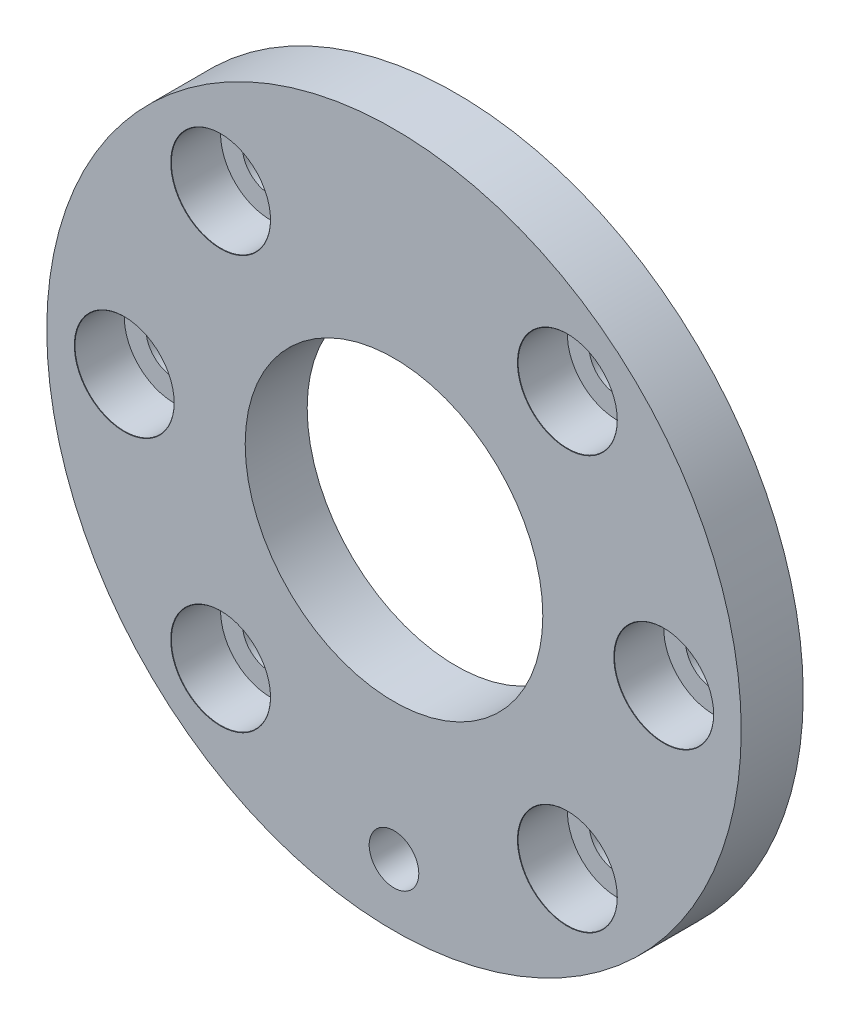
ISO-10303-21;
HEADER;
FILE_DESCRIPTION(('STEP AP214'),'2;1');
FILE_NAME('part.step','',(''),(''),'','','');
FILE_SCHEMA(('AUTOMOTIVE_DESIGN { 1 0 10303 214 1 1 1 1 }'));
ENDSEC;
DATA;
#1=APPLICATION_CONTEXT('core data for automotive mechanical design processes');
#2=APPLICATION_PROTOCOL_DEFINITION('international standard','automotive_design',2000,#1);
#3=PRODUCT_CONTEXT('',#1,'mechanical');
#4=PRODUCT('Part','Part','',(#3));
#5=PRODUCT_RELATED_PRODUCT_CATEGORY('part','',(#4));
#6=PRODUCT_DEFINITION_FORMATION('','',#4);
#7=PRODUCT_DEFINITION_CONTEXT('part definition',#1,'design');
#8=PRODUCT_DEFINITION('design','',#6,#7);
#9=PRODUCT_DEFINITION_SHAPE('','',#8);
#10=(LENGTH_UNIT() NAMED_UNIT(*) SI_UNIT(.MILLI.,.METRE.));
#11=(NAMED_UNIT(*) PLANE_ANGLE_UNIT() SI_UNIT($,.RADIAN.));
#12=(NAMED_UNIT(*) SI_UNIT($,.STERADIAN.) SOLID_ANGLE_UNIT());
#13=UNCERTAINTY_MEASURE_WITH_UNIT(LENGTH_MEASURE(1.E-05),#10,'distance_accuracy_value','');
#14=(GEOMETRIC_REPRESENTATION_CONTEXT(3) GLOBAL_UNCERTAINTY_ASSIGNED_CONTEXT((#13)) GLOBAL_UNIT_ASSIGNED_CONTEXT((#10,
#11,#12)) REPRESENTATION_CONTEXT('',''));
#15=CARTESIAN_POINT('',(0.,0.,0.));
#16=DIRECTION('',(0.,0.,1.));
#17=DIRECTION('',(1.,0.,0.));
#18=AXIS2_PLACEMENT_3D('',#15,#16,#17);
#19=CARTESIAN_POINT('',(0.,0.,5.));
#20=DIRECTION('',(0.,0.,1.));
#21=DIRECTION('',(1.,0.,0.));
#22=AXIS2_PLACEMENT_3D('',#19,#20,#21);
#23=PLANE('',#22);
#24=CARTESIAN_POINT('',(0.,-23.,5.));
#25=DIRECTION('',(0.,0.,1.));
#26=DIRECTION('',(1.,0.,0.));
#27=AXIS2_PLACEMENT_3D('',#24,#25,#26);
#28=CIRCLE('',#27,2.);
#29=CARTESIAN_POINT('',(2.,-23.,5.));
#30=VERTEX_POINT('',#29);
#31=EDGE_CURVE('E179',#30,#30,#28,.F.);
#32=ORIENTED_EDGE('',*,*,#31,.T.);
#33=EDGE_LOOP('',(#32));
#34=FACE_BOUND('',#33,.T.);
#35=CARTESIAN_POINT('',(-13.98063051,16.66146664,5.));
#36=DIRECTION('',(0.,0.,1.));
#37=DIRECTION('',(1.,0.,0.));
#38=AXIS2_PLACEMENT_3D('',#35,#36,#37);
#39=CIRCLE('',#38,4.025);
#40=CARTESIAN_POINT('',(-9.95563051,16.66146664,5.));
#41=VERTEX_POINT('',#40);
#42=EDGE_CURVE('E175',#41,#41,#39,.T.);
#43=ORIENTED_EDGE('',*,*,#42,.F.);
#44=EDGE_LOOP('',(#43));
#45=FACE_BOUND('',#44,.T.);
#46=CARTESIAN_POINT('',(13.98063051,-16.66146664,5.));
#47=DIRECTION('',(0.,0.,1.));
#48=DIRECTION('',(1.,0.,0.));
#49=AXIS2_PLACEMENT_3D('',#46,#47,#48);
#50=CIRCLE('',#49,4.025);
#51=CARTESIAN_POINT('',(18.00563051,-16.66146664,5.));
#52=VERTEX_POINT('',#51);
#53=EDGE_CURVE('E155',#52,#52,#50,.T.);
#54=ORIENTED_EDGE('',*,*,#53,.F.);
#55=EDGE_LOOP('',(#54));
#56=FACE_BOUND('',#55,.T.);
#57=CARTESIAN_POINT('',(-13.98063051,-16.66146664,5.));
#58=DIRECTION('',(0.,0.,1.));
#59=DIRECTION('',(1.,0.,0.));
#60=AXIS2_PLACEMENT_3D('',#57,#58,#59);
#61=CIRCLE('',#60,4.025);
#62=CARTESIAN_POINT('',(-9.95563051,-16.66146664,5.));
#63=VERTEX_POINT('',#62);
#64=EDGE_CURVE('E135',#63,#63,#61,.T.);
#65=ORIENTED_EDGE('',*,*,#64,.F.);
#66=EDGE_LOOP('',(#65));
#67=FACE_BOUND('',#66,.T.);
#68=CARTESIAN_POINT('',(13.98063051,16.66146664,5.));
#69=DIRECTION('',(0.,0.,1.));
#70=DIRECTION('',(1.,0.,0.));
#71=AXIS2_PLACEMENT_3D('',#68,#69,#70);
#72=CIRCLE('',#71,4.025);
#73=CARTESIAN_POINT('',(18.00563051,16.66146664,5.));
#74=VERTEX_POINT('',#73);
#75=EDGE_CURVE('E115',#74,#74,#72,.T.);
#76=ORIENTED_EDGE('',*,*,#75,.F.);
#77=EDGE_LOOP('',(#76));
#78=FACE_BOUND('',#77,.T.);
#79=CARTESIAN_POINT('',(-21.75,0.,5.));
#80=DIRECTION('',(0.,0.,1.));
#81=DIRECTION('',(1.,0.,0.));
#82=AXIS2_PLACEMENT_3D('',#79,#80,#81);
#83=CIRCLE('',#82,4.025);
#84=CARTESIAN_POINT('',(-17.725,0.,5.));
#85=VERTEX_POINT('',#84);
#86=EDGE_CURVE('E95',#85,#85,#83,.T.);
#87=ORIENTED_EDGE('',*,*,#86,.F.);
#88=EDGE_LOOP('',(#87));
#89=FACE_BOUND('',#88,.T.);
#90=CARTESIAN_POINT('',(21.75,0.,5.));
#91=DIRECTION('',(0.,0.,1.));
#92=DIRECTION('',(1.,0.,0.));
#93=AXIS2_PLACEMENT_3D('',#90,#91,#92);
#94=CIRCLE('',#93,4.025);
#95=CARTESIAN_POINT('',(25.775,0.,5.));
#96=VERTEX_POINT('',#95);
#97=EDGE_CURVE('E75',#96,#96,#94,.T.);
#98=ORIENTED_EDGE('',*,*,#97,.F.);
#99=EDGE_LOOP('',(#98));
#100=FACE_BOUND('',#99,.T.);
#101=CARTESIAN_POINT('',(0.,0.,5.));
#102=DIRECTION('',(0.,0.,1.));
#103=DIRECTION('',(1.,0.,0.));
#104=AXIS2_PLACEMENT_3D('',#101,#102,#103);
#105=CIRCLE('',#104,28.);
#106=CARTESIAN_POINT('',(28.,0.,5.));
#107=VERTEX_POINT('',#106);
#108=EDGE_CURVE('E10',#107,#107,#105,.T.);
#109=ORIENTED_EDGE('',*,*,#108,.T.);
#110=EDGE_LOOP('',(#109));
#111=FACE_BOUND('',#110,.T.);
#112=CARTESIAN_POINT('',(0.,0.,5.));
#113=DIRECTION('',(0.,0.,1.));
#114=DIRECTION('',(1.,0.,0.));
#115=AXIS2_PLACEMENT_3D('',#112,#113,#114);
#116=CIRCLE('',#115,12.);
#117=CARTESIAN_POINT('',(12.,0.,5.));
#118=VERTEX_POINT('',#117);
#119=EDGE_CURVE('E50',#118,#118,#116,.T.);
#120=ORIENTED_EDGE('',*,*,#119,.F.);
#121=EDGE_LOOP('',(#120));
#122=FACE_BOUND('',#121,.T.);
#123=ADVANCED_FACE('F37',(#34,#45,#56,#67,#78,#89,#100,#111,#122),#23,.T.);
#124=CARTESIAN_POINT('',(0.,0.,0.));
#125=DIRECTION('',(0.,0.,1.));
#126=DIRECTION('',(1.,0.,0.));
#127=AXIS2_PLACEMENT_3D('',#124,#125,#126);
#128=PLANE('',#127);
#129=CARTESIAN_POINT('',(0.,-23.,0.));
#130=DIRECTION('',(0.,0.,1.));
#131=DIRECTION('',(1.,0.,0.));
#132=AXIS2_PLACEMENT_3D('',#129,#130,#131);
#133=CIRCLE('',#132,2.);
#134=CARTESIAN_POINT('',(2.,-23.,0.));
#135=VERTEX_POINT('',#134);
#136=EDGE_CURVE('E183',#135,#135,#133,.T.);
#137=ORIENTED_EDGE('',*,*,#136,.T.);
#138=EDGE_LOOP('',(#137));
#139=FACE_BOUND('',#138,.T.);
#140=CARTESIAN_POINT('',(-13.98063051,16.66146664,0.));
#141=DIRECTION('',(0.,0.,1.));
#142=DIRECTION('',(1.,0.,0.));
#143=AXIS2_PLACEMENT_3D('',#140,#141,#142);
#144=CIRCLE('',#143,2.25);
#145=CARTESIAN_POINT('',(-11.73063051,16.66146664,0.));
#146=VERTEX_POINT('',#145);
#147=EDGE_CURVE('E159',#146,#146,#144,.T.);
#148=ORIENTED_EDGE('',*,*,#147,.T.);
#149=EDGE_LOOP('',(#148));
#150=FACE_BOUND('',#149,.T.);
#151=CARTESIAN_POINT('',(13.98063051,-16.66146664,0.));
#152=DIRECTION('',(0.,0.,1.));
#153=DIRECTION('',(1.,0.,0.));
#154=AXIS2_PLACEMENT_3D('',#151,#152,#153);
#155=CIRCLE('',#154,2.25);
#156=CARTESIAN_POINT('',(16.23063051,-16.66146664,0.));
#157=VERTEX_POINT('',#156);
#158=EDGE_CURVE('E139',#157,#157,#155,.T.);
#159=ORIENTED_EDGE('',*,*,#158,.T.);
#160=EDGE_LOOP('',(#159));
#161=FACE_BOUND('',#160,.T.);
#162=CARTESIAN_POINT('',(-13.98063051,-16.66146664,0.));
#163=DIRECTION('',(0.,0.,1.));
#164=DIRECTION('',(1.,0.,0.));
#165=AXIS2_PLACEMENT_3D('',#162,#163,#164);
#166=CIRCLE('',#165,2.25);
#167=CARTESIAN_POINT('',(-11.73063051,-16.66146664,0.));
#168=VERTEX_POINT('',#167);
#169=EDGE_CURVE('E119',#168,#168,#166,.T.);
#170=ORIENTED_EDGE('',*,*,#169,.T.);
#171=EDGE_LOOP('',(#170));
#172=FACE_BOUND('',#171,.T.);
#173=CARTESIAN_POINT('',(13.98063051,16.66146664,0.));
#174=DIRECTION('',(0.,0.,1.));
#175=DIRECTION('',(1.,0.,0.));
#176=AXIS2_PLACEMENT_3D('',#173,#174,#175);
#177=CIRCLE('',#176,2.25);
#178=CARTESIAN_POINT('',(16.23063051,16.66146664,0.));
#179=VERTEX_POINT('',#178);
#180=EDGE_CURVE('E99',#179,#179,#177,.T.);
#181=ORIENTED_EDGE('',*,*,#180,.T.);
#182=EDGE_LOOP('',(#181));
#183=FACE_BOUND('',#182,.T.);
#184=CARTESIAN_POINT('',(-21.75,0.,0.));
#185=DIRECTION('',(0.,0.,1.));
#186=DIRECTION('',(1.,0.,0.));
#187=AXIS2_PLACEMENT_3D('',#184,#185,#186);
#188=CIRCLE('',#187,2.25);
#189=CARTESIAN_POINT('',(-19.5,0.,0.));
#190=VERTEX_POINT('',#189);
#191=EDGE_CURVE('E79',#190,#190,#188,.T.);
#192=ORIENTED_EDGE('',*,*,#191,.T.);
#193=EDGE_LOOP('',(#192));
#194=FACE_BOUND('',#193,.T.);
#195=CARTESIAN_POINT('',(21.75,0.,0.));
#196=DIRECTION('',(0.,0.,1.));
#197=DIRECTION('',(1.,0.,0.));
#198=AXIS2_PLACEMENT_3D('',#195,#196,#197);
#199=CIRCLE('',#198,2.25);
#200=CARTESIAN_POINT('',(24.,0.,0.));
#201=VERTEX_POINT('',#200);
#202=EDGE_CURVE('E56',#201,#201,#199,.T.);
#203=ORIENTED_EDGE('',*,*,#202,.T.);
#204=EDGE_LOOP('',(#203));
#205=FACE_BOUND('',#204,.T.);
#206=CARTESIAN_POINT('',(0.,0.,0.));
#207=DIRECTION('',(0.,0.,1.));
#208=DIRECTION('',(1.,0.,0.));
#209=AXIS2_PLACEMENT_3D('',#206,#207,#208);
#210=CIRCLE('',#209,28.);
#211=CARTESIAN_POINT('',(28.,0.,0.));
#212=VERTEX_POINT('',#211);
#213=EDGE_CURVE('E41',#212,#212,#210,.T.);
#214=ORIENTED_EDGE('',*,*,#213,.F.);
#215=EDGE_LOOP('',(#214));
#216=FACE_BOUND('',#215,.T.);
#217=CARTESIAN_POINT('',(0.,0.,0.));
#218=DIRECTION('',(0.,0.,1.));
#219=DIRECTION('',(1.,0.,0.));
#220=AXIS2_PLACEMENT_3D('',#217,#218,#219);
#221=CIRCLE('',#220,12.);
#222=CARTESIAN_POINT('',(12.,0.,0.));
#223=VERTEX_POINT('',#222);
#224=EDGE_CURVE('E52',#223,#223,#221,.T.);
#225=ORIENTED_EDGE('',*,*,#224,.T.);
#226=EDGE_LOOP('',(#225));
#227=FACE_BOUND('',#226,.T.);
#228=ADVANCED_FACE('F188',(#139,#150,#161,#172,#183,#194,#205,#216,#227),#128,.F.);
#229=CARTESIAN_POINT('',(0.,0.,5.));
#230=DIRECTION('',(0.,0.,-1.));
#231=DIRECTION('',(-1.,0.,0.));
#232=AXIS2_PLACEMENT_3D('',#229,#230,#231);
#233=CYLINDRICAL_SURFACE('',#232,28.);
#234=ORIENTED_EDGE('',*,*,#108,.F.);
#235=EDGE_LOOP('',(#234));
#236=FACE_BOUND('',#235,.T.);
#237=ORIENTED_EDGE('',*,*,#213,.T.);
#238=EDGE_LOOP('',(#237));
#239=FACE_BOUND('',#238,.T.);
#240=ADVANCED_FACE('F39',(#236,#239),#233,.T.);
#241=CARTESIAN_POINT('',(0.,0.,5.));
#242=DIRECTION('',(0.,0.,-1.));
#243=DIRECTION('',(-1.,0.,0.));
#244=AXIS2_PLACEMENT_3D('',#241,#242,#243);
#245=CYLINDRICAL_SURFACE('',#244,12.);
#246=ORIENTED_EDGE('',*,*,#119,.T.);
#247=EDGE_LOOP('',(#246));
#248=FACE_BOUND('',#247,.T.);
#249=ORIENTED_EDGE('',*,*,#224,.F.);
#250=EDGE_LOOP('',(#249));
#251=FACE_BOUND('',#250,.T.);
#252=ADVANCED_FACE('F211',(#248,#251),#245,.F.);
#253=CARTESIAN_POINT('',(21.75,0.,5.));
#254=DIRECTION('',(0.,0.,1.));
#255=DIRECTION('',(1.,0.,0.));
#256=AXIS2_PLACEMENT_3D('',#253,#254,#255);
#257=CYLINDRICAL_SURFACE('',#256,2.25);
#258=ORIENTED_EDGE('',*,*,#202,.F.);
#259=EDGE_LOOP('',(#258));
#260=FACE_BOUND('',#259,.T.);
#261=CARTESIAN_POINT('',(21.75,0.,0.999999999999999));
#262=DIRECTION('',(0.,0.,1.));
#263=DIRECTION('',(1.,0.,0.));
#264=AXIS2_PLACEMENT_3D('',#261,#262,#263);
#265=CIRCLE('',#264,2.25);
#266=CARTESIAN_POINT('',(24.,0.,0.999999999999999));
#267=VERTEX_POINT('',#266);
#268=EDGE_CURVE('E63',#267,#267,#265,.T.);
#269=ORIENTED_EDGE('',*,*,#268,.T.);
#270=EDGE_LOOP('',(#269));
#271=FACE_BOUND('',#270,.T.);
#272=ADVANCED_FACE('F214',(#260,#271),#257,.F.);
#273=CARTESIAN_POINT('',(25.75,0.,0.999999999999999));
#274=DIRECTION('',(0.,0.,-1.));
#275=DIRECTION('',(-1.,0.,0.));
#276=AXIS2_PLACEMENT_3D('',#273,#274,#275);
#277=PLANE('',#276);
#278=ORIENTED_EDGE('',*,*,#268,.F.);
#279=EDGE_LOOP('',(#278));
#280=FACE_BOUND('',#279,.T.);
#281=CARTESIAN_POINT('',(21.75,0.,0.999999999999999));
#282=DIRECTION('',(0.,0.,1.));
#283=DIRECTION('',(1.,0.,0.));
#284=AXIS2_PLACEMENT_3D('',#281,#282,#283);
#285=CIRCLE('',#284,4.);
#286=CARTESIAN_POINT('',(25.75,0.,0.999999999999999));
#287=VERTEX_POINT('',#286);
#288=EDGE_CURVE('E67',#287,#287,#285,.T.);
#289=ORIENTED_EDGE('',*,*,#288,.T.);
#290=EDGE_LOOP('',(#289));
#291=FACE_BOUND('',#290,.T.);
#292=ADVANCED_FACE('F218',(#280,#291),#277,.F.);
#293=CARTESIAN_POINT('',(21.75,0.,5.));
#294=DIRECTION('',(0.,0.,1.));
#295=DIRECTION('',(1.,0.,0.));
#296=AXIS2_PLACEMENT_3D('',#293,#294,#295);
#297=CYLINDRICAL_SURFACE('',#296,4.);
#298=ORIENTED_EDGE('',*,*,#288,.F.);
#299=EDGE_LOOP('',(#298));
#300=FACE_BOUND('',#299,.T.);
#301=CARTESIAN_POINT('',(21.75,0.,4.97585778062982));
#302=DIRECTION('',(0.,0.,1.));
#303=DIRECTION('',(1.,0.,0.));
#304=AXIS2_PLACEMENT_3D('',#301,#302,#303);
#305=CIRCLE('',#304,4.);
#306=CARTESIAN_POINT('',(25.75,0.,4.97585778062982));
#307=VERTEX_POINT('',#306);
#308=EDGE_CURVE('E71',#307,#307,#305,.T.);
#309=ORIENTED_EDGE('',*,*,#308,.T.);
#310=EDGE_LOOP('',(#309));
#311=FACE_BOUND('',#310,.T.);
#312=ADVANCED_FACE('F222',(#300,#311),#297,.F.);
#313=CARTESIAN_POINT('',(21.75,0.,5.));
#314=DIRECTION('',(0.,0.,1.));
#315=DIRECTION('',(1.,0.,0.));
#316=AXIS2_PLACEMENT_3D('',#313,#314,#315);
#317=CONICAL_SURFACE('',#316,4.025,0.802851455917437);
#318=ORIENTED_EDGE('',*,*,#308,.F.);
#319=EDGE_LOOP('',(#318));
#320=FACE_BOUND('',#319,.T.);
#321=ORIENTED_EDGE('',*,*,#97,.T.);
#322=EDGE_LOOP('',(#321));
#323=FACE_BOUND('',#322,.T.);
#324=ADVANCED_FACE('F226',(#320,#323),#317,.F.);
#325=CARTESIAN_POINT('',(-21.75,0.,5.));
#326=DIRECTION('',(0.,0.,1.));
#327=DIRECTION('',(1.,0.,0.));
#328=AXIS2_PLACEMENT_3D('',#325,#326,#327);
#329=CYLINDRICAL_SURFACE('',#328,2.25);
#330=ORIENTED_EDGE('',*,*,#191,.F.);
#331=EDGE_LOOP('',(#330));
#332=FACE_BOUND('',#331,.T.);
#333=CARTESIAN_POINT('',(-21.75,0.,1.));
#334=DIRECTION('',(0.,0.,1.));
#335=DIRECTION('',(1.,0.,0.));
#336=AXIS2_PLACEMENT_3D('',#333,#334,#335);
#337=CIRCLE('',#336,2.25);
#338=CARTESIAN_POINT('',(-19.5,0.,1.));
#339=VERTEX_POINT('',#338);
#340=EDGE_CURVE('E83',#339,#339,#337,.T.);
#341=ORIENTED_EDGE('',*,*,#340,.T.);
#342=EDGE_LOOP('',(#341));
#343=FACE_BOUND('',#342,.T.);
#344=ADVANCED_FACE('F230',(#332,#343),#329,.F.);
#345=CARTESIAN_POINT('',(-17.75,0.,1.));
#346=DIRECTION('',(0.,0.,-1.));
#347=DIRECTION('',(-1.,0.,0.));
#348=AXIS2_PLACEMENT_3D('',#345,#346,#347);
#349=PLANE('',#348);
#350=ORIENTED_EDGE('',*,*,#340,.F.);
#351=EDGE_LOOP('',(#350));
#352=FACE_BOUND('',#351,.T.);
#353=CARTESIAN_POINT('',(-21.75,0.,1.));
#354=DIRECTION('',(0.,0.,1.));
#355=DIRECTION('',(1.,0.,0.));
#356=AXIS2_PLACEMENT_3D('',#353,#354,#355);
#357=CIRCLE('',#356,4.);
#358=CARTESIAN_POINT('',(-17.75,0.,1.));
#359=VERTEX_POINT('',#358);
#360=EDGE_CURVE('E87',#359,#359,#357,.T.);
#361=ORIENTED_EDGE('',*,*,#360,.T.);
#362=EDGE_LOOP('',(#361));
#363=FACE_BOUND('',#362,.T.);
#364=ADVANCED_FACE('F234',(#352,#363),#349,.F.);
#365=CARTESIAN_POINT('',(-21.75,0.,5.));
#366=DIRECTION('',(0.,0.,1.));
#367=DIRECTION('',(1.,0.,0.));
#368=AXIS2_PLACEMENT_3D('',#365,#366,#367);
#369=CYLINDRICAL_SURFACE('',#368,4.);
#370=ORIENTED_EDGE('',*,*,#360,.F.);
#371=EDGE_LOOP('',(#370));
#372=FACE_BOUND('',#371,.T.);
#373=CARTESIAN_POINT('',(-21.75,0.,4.97585778062982));
#374=DIRECTION('',(0.,0.,1.));
#375=DIRECTION('',(1.,0.,0.));
#376=AXIS2_PLACEMENT_3D('',#373,#374,#375);
#377=CIRCLE('',#376,4.);
#378=CARTESIAN_POINT('',(-17.75,0.,4.97585778062982));
#379=VERTEX_POINT('',#378);
#380=EDGE_CURVE('E91',#379,#379,#377,.T.);
#381=ORIENTED_EDGE('',*,*,#380,.T.);
#382=EDGE_LOOP('',(#381));
#383=FACE_BOUND('',#382,.T.);
#384=ADVANCED_FACE('F238',(#372,#383),#369,.F.);
#385=CARTESIAN_POINT('',(-21.75,0.,5.));
#386=DIRECTION('',(0.,0.,1.));
#387=DIRECTION('',(1.,0.,0.));
#388=AXIS2_PLACEMENT_3D('',#385,#386,#387);
#389=CONICAL_SURFACE('',#388,4.025,0.802851455917437);
#390=ORIENTED_EDGE('',*,*,#380,.F.);
#391=EDGE_LOOP('',(#390));
#392=FACE_BOUND('',#391,.T.);
#393=ORIENTED_EDGE('',*,*,#86,.T.);
#394=EDGE_LOOP('',(#393));
#395=FACE_BOUND('',#394,.T.);
#396=ADVANCED_FACE('F242',(#392,#395),#389,.F.);
#397=CARTESIAN_POINT('',(13.98063051,16.66146664,5.));
#398=DIRECTION('',(0.,0.,1.));
#399=DIRECTION('',(1.,0.,0.));
#400=AXIS2_PLACEMENT_3D('',#397,#398,#399);
#401=CYLINDRICAL_SURFACE('',#400,2.25);
#402=ORIENTED_EDGE('',*,*,#180,.F.);
#403=EDGE_LOOP('',(#402));
#404=FACE_BOUND('',#403,.T.);
#405=CARTESIAN_POINT('',(13.98063051,16.66146664,1.));
#406=DIRECTION('',(0.,0.,1.));
#407=DIRECTION('',(1.,0.,0.));
#408=AXIS2_PLACEMENT_3D('',#405,#406,#407);
#409=CIRCLE('',#408,2.25);
#410=CARTESIAN_POINT('',(16.23063051,16.66146664,1.));
#411=VERTEX_POINT('',#410);
#412=EDGE_CURVE('E103',#411,#411,#409,.T.);
#413=ORIENTED_EDGE('',*,*,#412,.T.);
#414=EDGE_LOOP('',(#413));
#415=FACE_BOUND('',#414,.T.);
#416=ADVANCED_FACE('F246',(#404,#415),#401,.F.);
#417=CARTESIAN_POINT('',(17.98063051,16.66146664,1.));
#418=DIRECTION('',(0.,0.,-1.));
#419=DIRECTION('',(-1.,0.,0.));
#420=AXIS2_PLACEMENT_3D('',#417,#418,#419);
#421=PLANE('',#420);
#422=ORIENTED_EDGE('',*,*,#412,.F.);
#423=EDGE_LOOP('',(#422));
#424=FACE_BOUND('',#423,.T.);
#425=CARTESIAN_POINT('',(13.98063051,16.66146664,1.));
#426=DIRECTION('',(0.,0.,1.));
#427=DIRECTION('',(1.,0.,0.));
#428=AXIS2_PLACEMENT_3D('',#425,#426,#427);
#429=CIRCLE('',#428,4.);
#430=CARTESIAN_POINT('',(17.98063051,16.66146664,1.));
#431=VERTEX_POINT('',#430);
#432=EDGE_CURVE('E107',#431,#431,#429,.T.);
#433=ORIENTED_EDGE('',*,*,#432,.T.);
#434=EDGE_LOOP('',(#433));
#435=FACE_BOUND('',#434,.T.);
#436=ADVANCED_FACE('F250',(#424,#435),#421,.F.);
#437=CARTESIAN_POINT('',(13.98063051,16.66146664,5.));
#438=DIRECTION('',(0.,0.,1.));
#439=DIRECTION('',(1.,0.,0.));
#440=AXIS2_PLACEMENT_3D('',#437,#438,#439);
#441=CYLINDRICAL_SURFACE('',#440,4.);
#442=ORIENTED_EDGE('',*,*,#432,.F.);
#443=EDGE_LOOP('',(#442));
#444=FACE_BOUND('',#443,.T.);
#445=CARTESIAN_POINT('',(13.98063051,16.66146664,4.97585778062982));
#446=DIRECTION('',(0.,0.,1.));
#447=DIRECTION('',(1.,0.,0.));
#448=AXIS2_PLACEMENT_3D('',#445,#446,#447);
#449=CIRCLE('',#448,4.);
#450=CARTESIAN_POINT('',(17.98063051,16.66146664,4.97585778062982));
#451=VERTEX_POINT('',#450);
#452=EDGE_CURVE('E111',#451,#451,#449,.T.);
#453=ORIENTED_EDGE('',*,*,#452,.T.);
#454=EDGE_LOOP('',(#453));
#455=FACE_BOUND('',#454,.T.);
#456=ADVANCED_FACE('F254',(#444,#455),#441,.F.);
#457=CARTESIAN_POINT('',(13.98063051,16.66146664,5.));
#458=DIRECTION('',(0.,0.,1.));
#459=DIRECTION('',(1.,0.,0.));
#460=AXIS2_PLACEMENT_3D('',#457,#458,#459);
#461=CONICAL_SURFACE('',#460,4.025,0.802851455917437);
#462=ORIENTED_EDGE('',*,*,#452,.F.);
#463=EDGE_LOOP('',(#462));
#464=FACE_BOUND('',#463,.T.);
#465=ORIENTED_EDGE('',*,*,#75,.T.);
#466=EDGE_LOOP('',(#465));
#467=FACE_BOUND('',#466,.T.);
#468=ADVANCED_FACE('F258',(#464,#467),#461,.F.);
#469=CARTESIAN_POINT('',(-13.98063051,-16.66146664,5.));
#470=DIRECTION('',(0.,0.,1.));
#471=DIRECTION('',(1.,0.,0.));
#472=AXIS2_PLACEMENT_3D('',#469,#470,#471);
#473=CYLINDRICAL_SURFACE('',#472,2.25);
#474=ORIENTED_EDGE('',*,*,#169,.F.);
#475=EDGE_LOOP('',(#474));
#476=FACE_BOUND('',#475,.T.);
#477=CARTESIAN_POINT('',(-13.98063051,-16.66146664,1.));
#478=DIRECTION('',(0.,0.,1.));
#479=DIRECTION('',(1.,0.,0.));
#480=AXIS2_PLACEMENT_3D('',#477,#478,#479);
#481=CIRCLE('',#480,2.25);
#482=CARTESIAN_POINT('',(-11.73063051,-16.66146664,1.));
#483=VERTEX_POINT('',#482);
#484=EDGE_CURVE('E123',#483,#483,#481,.T.);
#485=ORIENTED_EDGE('',*,*,#484,.T.);
#486=EDGE_LOOP('',(#485));
#487=FACE_BOUND('',#486,.T.);
#488=ADVANCED_FACE('F262',(#476,#487),#473,.F.);
#489=CARTESIAN_POINT('',(-9.98063051,-16.66146664,1.));
#490=DIRECTION('',(0.,0.,-1.));
#491=DIRECTION('',(-1.,0.,0.));
#492=AXIS2_PLACEMENT_3D('',#489,#490,#491);
#493=PLANE('',#492);
#494=ORIENTED_EDGE('',*,*,#484,.F.);
#495=EDGE_LOOP('',(#494));
#496=FACE_BOUND('',#495,.T.);
#497=CARTESIAN_POINT('',(-13.98063051,-16.66146664,1.));
#498=DIRECTION('',(0.,0.,1.));
#499=DIRECTION('',(1.,0.,0.));
#500=AXIS2_PLACEMENT_3D('',#497,#498,#499);
#501=CIRCLE('',#500,4.);
#502=CARTESIAN_POINT('',(-9.98063051,-16.66146664,1.));
#503=VERTEX_POINT('',#502);
#504=EDGE_CURVE('E127',#503,#503,#501,.T.);
#505=ORIENTED_EDGE('',*,*,#504,.T.);
#506=EDGE_LOOP('',(#505));
#507=FACE_BOUND('',#506,.T.);
#508=ADVANCED_FACE('F266',(#496,#507),#493,.F.);
#509=CARTESIAN_POINT('',(-13.98063051,-16.66146664,5.));
#510=DIRECTION('',(0.,0.,1.));
#511=DIRECTION('',(1.,0.,0.));
#512=AXIS2_PLACEMENT_3D('',#509,#510,#511);
#513=CYLINDRICAL_SURFACE('',#512,4.);
#514=ORIENTED_EDGE('',*,*,#504,.F.);
#515=EDGE_LOOP('',(#514));
#516=FACE_BOUND('',#515,.T.);
#517=CARTESIAN_POINT('',(-13.98063051,-16.66146664,4.97585778062982));
#518=DIRECTION('',(0.,0.,1.));
#519=DIRECTION('',(1.,0.,0.));
#520=AXIS2_PLACEMENT_3D('',#517,#518,#519);
#521=CIRCLE('',#520,4.);
#522=CARTESIAN_POINT('',(-9.98063051,-16.66146664,4.97585778062982));
#523=VERTEX_POINT('',#522);
#524=EDGE_CURVE('E131',#523,#523,#521,.T.);
#525=ORIENTED_EDGE('',*,*,#524,.T.);
#526=EDGE_LOOP('',(#525));
#527=FACE_BOUND('',#526,.T.);
#528=ADVANCED_FACE('F270',(#516,#527),#513,.F.);
#529=CARTESIAN_POINT('',(-13.98063051,-16.66146664,5.));
#530=DIRECTION('',(0.,0.,1.));
#531=DIRECTION('',(1.,0.,0.));
#532=AXIS2_PLACEMENT_3D('',#529,#530,#531);
#533=CONICAL_SURFACE('',#532,4.025,0.802851455917402);
#534=ORIENTED_EDGE('',*,*,#524,.F.);
#535=EDGE_LOOP('',(#534));
#536=FACE_BOUND('',#535,.T.);
#537=ORIENTED_EDGE('',*,*,#64,.T.);
#538=EDGE_LOOP('',(#537));
#539=FACE_BOUND('',#538,.T.);
#540=ADVANCED_FACE('F274',(#536,#539),#533,.F.);
#541=CARTESIAN_POINT('',(13.98063051,-16.66146664,5.));
#542=DIRECTION('',(0.,0.,1.));
#543=DIRECTION('',(1.,0.,0.));
#544=AXIS2_PLACEMENT_3D('',#541,#542,#543);
#545=CYLINDRICAL_SURFACE('',#544,2.25);
#546=ORIENTED_EDGE('',*,*,#158,.F.);
#547=EDGE_LOOP('',(#546));
#548=FACE_BOUND('',#547,.T.);
#549=CARTESIAN_POINT('',(13.98063051,-16.66146664,1.));
#550=DIRECTION('',(0.,0.,1.));
#551=DIRECTION('',(1.,0.,0.));
#552=AXIS2_PLACEMENT_3D('',#549,#550,#551);
#553=CIRCLE('',#552,2.25);
#554=CARTESIAN_POINT('',(16.23063051,-16.66146664,1.));
#555=VERTEX_POINT('',#554);
#556=EDGE_CURVE('E143',#555,#555,#553,.T.);
#557=ORIENTED_EDGE('',*,*,#556,.T.);
#558=EDGE_LOOP('',(#557));
#559=FACE_BOUND('',#558,.T.);
#560=ADVANCED_FACE('F278',(#548,#559),#545,.F.);
#561=CARTESIAN_POINT('',(17.98063051,-16.66146664,1.));
#562=DIRECTION('',(0.,0.,-1.));
#563=DIRECTION('',(-1.,0.,0.));
#564=AXIS2_PLACEMENT_3D('',#561,#562,#563);
#565=PLANE('',#564);
#566=ORIENTED_EDGE('',*,*,#556,.F.);
#567=EDGE_LOOP('',(#566));
#568=FACE_BOUND('',#567,.T.);
#569=CARTESIAN_POINT('',(13.98063051,-16.66146664,1.));
#570=DIRECTION('',(0.,0.,1.));
#571=DIRECTION('',(1.,0.,0.));
#572=AXIS2_PLACEMENT_3D('',#569,#570,#571);
#573=CIRCLE('',#572,4.);
#574=CARTESIAN_POINT('',(17.98063051,-16.66146664,1.));
#575=VERTEX_POINT('',#574);
#576=EDGE_CURVE('E147',#575,#575,#573,.T.);
#577=ORIENTED_EDGE('',*,*,#576,.T.);
#578=EDGE_LOOP('',(#577));
#579=FACE_BOUND('',#578,.T.);
#580=ADVANCED_FACE('F282',(#568,#579),#565,.F.);
#581=CARTESIAN_POINT('',(13.98063051,-16.66146664,5.));
#582=DIRECTION('',(0.,0.,1.));
#583=DIRECTION('',(1.,0.,0.));
#584=AXIS2_PLACEMENT_3D('',#581,#582,#583);
#585=CYLINDRICAL_SURFACE('',#584,4.);
#586=ORIENTED_EDGE('',*,*,#576,.F.);
#587=EDGE_LOOP('',(#586));
#588=FACE_BOUND('',#587,.T.);
#589=CARTESIAN_POINT('',(13.98063051,-16.66146664,4.97585778062982));
#590=DIRECTION('',(0.,0.,1.));
#591=DIRECTION('',(1.,0.,0.));
#592=AXIS2_PLACEMENT_3D('',#589,#590,#591);
#593=CIRCLE('',#592,4.);
#594=CARTESIAN_POINT('',(17.98063051,-16.66146664,4.97585778062982));
#595=VERTEX_POINT('',#594);
#596=EDGE_CURVE('E151',#595,#595,#593,.T.);
#597=ORIENTED_EDGE('',*,*,#596,.T.);
#598=EDGE_LOOP('',(#597));
#599=FACE_BOUND('',#598,.T.);
#600=ADVANCED_FACE('F286',(#588,#599),#585,.F.);
#601=CARTESIAN_POINT('',(13.98063051,-16.66146664,5.));
#602=DIRECTION('',(0.,0.,1.));
#603=DIRECTION('',(1.,0.,0.));
#604=AXIS2_PLACEMENT_3D('',#601,#602,#603);
#605=CONICAL_SURFACE('',#604,4.025,0.802851455917437);
#606=ORIENTED_EDGE('',*,*,#596,.F.);
#607=EDGE_LOOP('',(#606));
#608=FACE_BOUND('',#607,.T.);
#609=ORIENTED_EDGE('',*,*,#53,.T.);
#610=EDGE_LOOP('',(#609));
#611=FACE_BOUND('',#610,.T.);
#612=ADVANCED_FACE('F290',(#608,#611),#605,.F.);
#613=CARTESIAN_POINT('',(-13.98063051,16.66146664,5.));
#614=DIRECTION('',(0.,0.,1.));
#615=DIRECTION('',(1.,0.,0.));
#616=AXIS2_PLACEMENT_3D('',#613,#614,#615);
#617=CYLINDRICAL_SURFACE('',#616,2.25);
#618=ORIENTED_EDGE('',*,*,#147,.F.);
#619=EDGE_LOOP('',(#618));
#620=FACE_BOUND('',#619,.T.);
#621=CARTESIAN_POINT('',(-13.98063051,16.66146664,1.));
#622=DIRECTION('',(0.,0.,1.));
#623=DIRECTION('',(1.,0.,0.));
#624=AXIS2_PLACEMENT_3D('',#621,#622,#623);
#625=CIRCLE('',#624,2.25);
#626=CARTESIAN_POINT('',(-11.73063051,16.66146664,1.));
#627=VERTEX_POINT('',#626);
#628=EDGE_CURVE('E163',#627,#627,#625,.T.);
#629=ORIENTED_EDGE('',*,*,#628,.T.);
#630=EDGE_LOOP('',(#629));
#631=FACE_BOUND('',#630,.T.);
#632=ADVANCED_FACE('F294',(#620,#631),#617,.F.);
#633=CARTESIAN_POINT('',(-9.98063051,16.66146664,1.));
#634=DIRECTION('',(0.,0.,-1.));
#635=DIRECTION('',(-1.,0.,0.));
#636=AXIS2_PLACEMENT_3D('',#633,#634,#635);
#637=PLANE('',#636);
#638=ORIENTED_EDGE('',*,*,#628,.F.);
#639=EDGE_LOOP('',(#638));
#640=FACE_BOUND('',#639,.T.);
#641=CARTESIAN_POINT('',(-13.98063051,16.66146664,1.));
#642=DIRECTION('',(0.,0.,1.));
#643=DIRECTION('',(1.,0.,0.));
#644=AXIS2_PLACEMENT_3D('',#641,#642,#643);
#645=CIRCLE('',#644,4.);
#646=CARTESIAN_POINT('',(-9.98063051,16.66146664,1.));
#647=VERTEX_POINT('',#646);
#648=EDGE_CURVE('E167',#647,#647,#645,.T.);
#649=ORIENTED_EDGE('',*,*,#648,.T.);
#650=EDGE_LOOP('',(#649));
#651=FACE_BOUND('',#650,.T.);
#652=ADVANCED_FACE('F298',(#640,#651),#637,.F.);
#653=CARTESIAN_POINT('',(-13.98063051,16.66146664,5.));
#654=DIRECTION('',(0.,0.,1.));
#655=DIRECTION('',(1.,0.,0.));
#656=AXIS2_PLACEMENT_3D('',#653,#654,#655);
#657=CYLINDRICAL_SURFACE('',#656,4.);
#658=ORIENTED_EDGE('',*,*,#648,.F.);
#659=EDGE_LOOP('',(#658));
#660=FACE_BOUND('',#659,.T.);
#661=CARTESIAN_POINT('',(-13.98063051,16.66146664,4.97585778062982));
#662=DIRECTION('',(0.,0.,1.));
#663=DIRECTION('',(1.,0.,0.));
#664=AXIS2_PLACEMENT_3D('',#661,#662,#663);
#665=CIRCLE('',#664,4.);
#666=CARTESIAN_POINT('',(-9.98063051,16.66146664,4.97585778062982));
#667=VERTEX_POINT('',#666);
#668=EDGE_CURVE('E171',#667,#667,#665,.T.);
#669=ORIENTED_EDGE('',*,*,#668,.T.);
#670=EDGE_LOOP('',(#669));
#671=FACE_BOUND('',#670,.T.);
#672=ADVANCED_FACE('F199',(#660,#671),#657,.F.);
#673=CARTESIAN_POINT('',(-13.98063051,16.66146664,5.));
#674=DIRECTION('',(0.,0.,1.));
#675=DIRECTION('',(1.,0.,0.));
#676=AXIS2_PLACEMENT_3D('',#673,#674,#675);
#677=CONICAL_SURFACE('',#676,4.025,0.802851455917402);
#678=ORIENTED_EDGE('',*,*,#668,.F.);
#679=EDGE_LOOP('',(#678));
#680=FACE_BOUND('',#679,.T.);
#681=ORIENTED_EDGE('',*,*,#42,.T.);
#682=EDGE_LOOP('',(#681));
#683=FACE_BOUND('',#682,.T.);
#684=ADVANCED_FACE('F193',(#680,#683),#677,.F.);
#685=CARTESIAN_POINT('',(0.,-23.,10.));
#686=DIRECTION('',(0.,0.,-1.));
#687=DIRECTION('',(-1.,0.,0.));
#688=AXIS2_PLACEMENT_3D('',#685,#686,#687);
#689=CYLINDRICAL_SURFACE('',#688,2.);
#690=ORIENTED_EDGE('',*,*,#31,.F.);
#691=EDGE_LOOP('',(#690));
#692=FACE_BOUND('',#691,.T.);
#693=ORIENTED_EDGE('',*,*,#136,.F.);
#694=EDGE_LOOP('',(#693));
#695=FACE_BOUND('',#694,.T.);
#696=ADVANCED_FACE('F191',(#692,#695),#689,.F.);
#697=CLOSED_SHELL('',(#123,#228,#240,#252,#272,#292,#312,#324,#344,#364,#384,#396,#416,#436,
#456,#468,#488,#508,#528,#540,#560,#580,#600,#612,#632,#652,#672,#684,#696));
#698=MANIFOLD_SOLID_BREP('B2',#697);
#699=ADVANCED_BREP_SHAPE_REPRESENTATION('',(#18,#698),#14);
#700=SHAPE_DEFINITION_REPRESENTATION(#9,#699);
ENDSEC;
END-ISO-10303-21;
